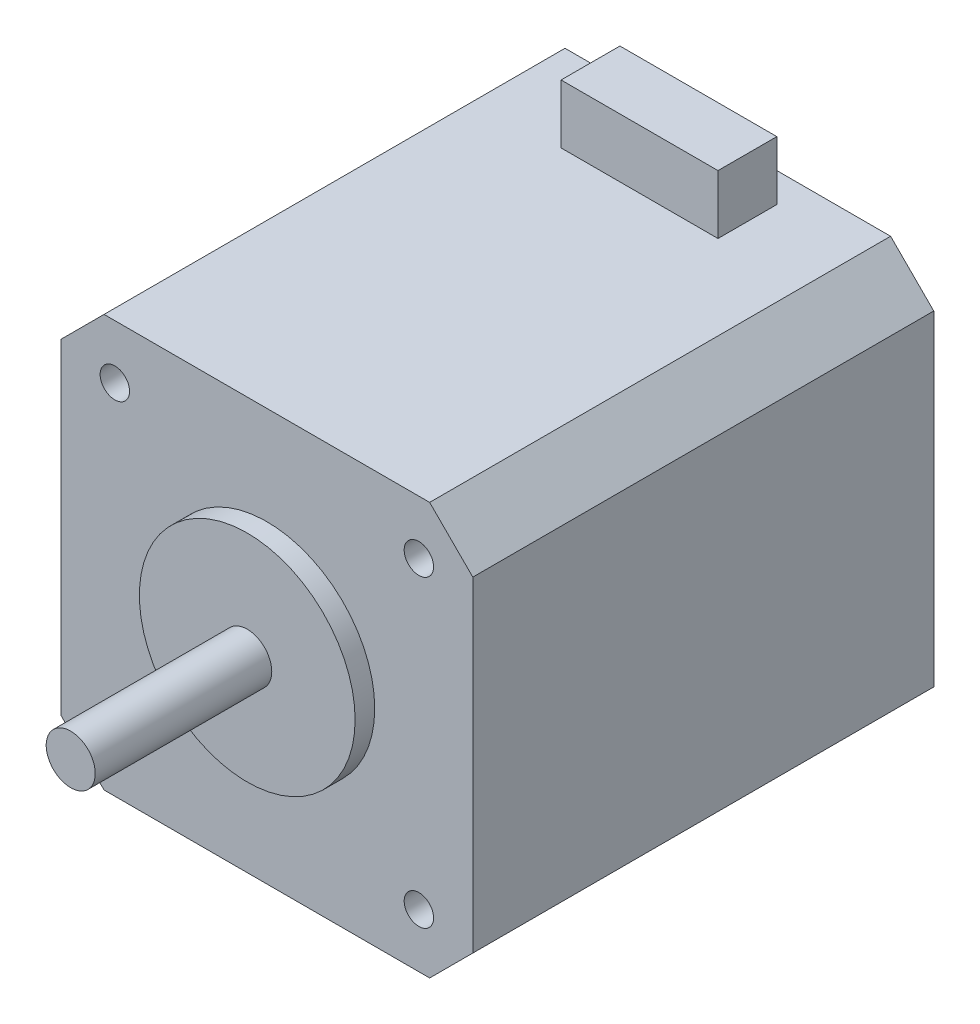
ISO-10303-21;
HEADER;
FILE_DESCRIPTION(('STEP AP214'),'2;1');
FILE_NAME('part.step','',(''),(''),'','','');
FILE_SCHEMA(('AUTOMOTIVE_DESIGN { 1 0 10303 214 1 1 1 1 }'));
ENDSEC;
DATA;
#1=APPLICATION_CONTEXT('core data for automotive mechanical design processes');
#2=APPLICATION_PROTOCOL_DEFINITION('international standard','automotive_design',2000,#1);
#3=PRODUCT_CONTEXT('',#1,'mechanical');
#4=PRODUCT('Part','Part','',(#3));
#5=PRODUCT_RELATED_PRODUCT_CATEGORY('part','',(#4));
#6=PRODUCT_DEFINITION_FORMATION('','',#4);
#7=PRODUCT_DEFINITION_CONTEXT('part definition',#1,'design');
#8=PRODUCT_DEFINITION('design','',#6,#7);
#9=PRODUCT_DEFINITION_SHAPE('','',#8);
#10=(LENGTH_UNIT() NAMED_UNIT(*) SI_UNIT(.MILLI.,.METRE.));
#11=(NAMED_UNIT(*) PLANE_ANGLE_UNIT() SI_UNIT($,.RADIAN.));
#12=(NAMED_UNIT(*) SI_UNIT($,.STERADIAN.) SOLID_ANGLE_UNIT());
#13=UNCERTAINTY_MEASURE_WITH_UNIT(LENGTH_MEASURE(1.E-05),#10,'distance_accuracy_value','');
#14=(GEOMETRIC_REPRESENTATION_CONTEXT(3) GLOBAL_UNCERTAINTY_ASSIGNED_CONTEXT((#13)) GLOBAL_UNIT_ASSIGNED_CONTEXT((#10,
#11,#12)) REPRESENTATION_CONTEXT('',''));
#15=CARTESIAN_POINT('',(0.,0.,0.));
#16=DIRECTION('',(0.,0.,1.));
#17=DIRECTION('',(1.,0.,0.));
#18=AXIS2_PLACEMENT_3D('',#15,#16,#17);
#19=CARTESIAN_POINT('',(0.,0.,47.));
#20=DIRECTION('',(0.,0.,1.));
#21=DIRECTION('',(1.,0.,0.));
#22=AXIS2_PLACEMENT_3D('',#19,#20,#21);
#23=PLANE('',#22);
#24=CARTESIAN_POINT('',(0.,0.,47.));
#25=DIRECTION('',(0.,0.,1.));
#26=DIRECTION('',(1.,0.,0.));
#27=AXIS2_PLACEMENT_3D('',#24,#25,#26);
#28=CIRCLE('',#27,11.);
#29=CARTESIAN_POINT('',(11.,0.,47.));
#30=VERTEX_POINT('',#29);
#31=EDGE_CURVE('E262',#30,#30,#28,.T.);
#32=ORIENTED_EDGE('',*,*,#31,.F.);
#33=EDGE_LOOP('',(#32));
#34=FACE_BOUND('',#33,.T.);
#35=CARTESIAN_POINT('',(-15.5000000000001,-15.4999999999999,47.));
#36=DIRECTION('',(0.,0.,1.));
#37=DIRECTION('',(1.,0.,0.));
#38=AXIS2_PLACEMENT_3D('',#35,#36,#37);
#39=CIRCLE('',#38,1.5);
#40=CARTESIAN_POINT('',(-14.0000000000001,-15.4999999999999,47.));
#41=VERTEX_POINT('',#40);
#42=EDGE_CURVE('E242',#41,#41,#39,.T.);
#43=ORIENTED_EDGE('',*,*,#42,.F.);
#44=EDGE_LOOP('',(#43));
#45=FACE_BOUND('',#44,.T.);
#46=CARTESIAN_POINT('',(15.5,15.5,47.));
#47=DIRECTION('',(0.,0.,1.));
#48=DIRECTION('',(1.,0.,0.));
#49=AXIS2_PLACEMENT_3D('',#46,#47,#48);
#50=CIRCLE('',#49,1.5);
#51=CARTESIAN_POINT('',(17.,15.5,47.));
#52=VERTEX_POINT('',#51);
#53=EDGE_CURVE('E161',#52,#52,#50,.T.);
#54=ORIENTED_EDGE('',*,*,#53,.F.);
#55=EDGE_LOOP('',(#54));
#56=FACE_BOUND('',#55,.T.);
#57=DIRECTION('',(0.,1.,0.));
#58=VECTOR('',#57,1.);
#59=CARTESIAN_POINT('',(20.9999999999999,-16.6000000000001,47.));
#60=LINE('',#59,#58);
#61=CARTESIAN_POINT('',(20.9999999999999,-16.6000000000001,47.));
#62=VERTEX_POINT('',#61);
#63=CARTESIAN_POINT('',(21.,16.6,47.));
#64=VERTEX_POINT('',#63);
#65=EDGE_CURVE('E108',#62,#64,#60,.T.);
#66=ORIENTED_EDGE('',*,*,#65,.T.);
#67=DIRECTION('',(-0.707106781186548,0.707106781186548,0.));
#68=VECTOR('',#67,1.);
#69=CARTESIAN_POINT('',(21.,16.6,47.));
#70=LINE('',#69,#68);
#71=CARTESIAN_POINT('',(16.6,21.,47.));
#72=VERTEX_POINT('',#71);
#73=EDGE_CURVE('E209',#64,#72,#70,.T.);
#74=ORIENTED_EDGE('',*,*,#73,.T.);
#75=DIRECTION('',(-1.,0.,0.));
#76=VECTOR('',#75,1.);
#77=CARTESIAN_POINT('',(16.6,21.,47.));
#78=LINE('',#77,#76);
#79=CARTESIAN_POINT('',(-16.5999999999998,21.0000000000002,47.));
#80=VERTEX_POINT('',#79);
#81=EDGE_CURVE('E205',#72,#80,#78,.T.);
#82=ORIENTED_EDGE('',*,*,#81,.T.);
#83=DIRECTION('',(-0.707106781186555,-0.70710678118654,0.));
#84=VECTOR('',#83,1.);
#85=CARTESIAN_POINT('',(-16.5999999999998,21.0000000000002,47.));
#86=LINE('',#85,#84);
#87=CARTESIAN_POINT('',(-20.9999999999998,16.6000000000002,47.));
#88=VERTEX_POINT('',#87);
#89=EDGE_CURVE('E220',#80,#88,#86,.T.);
#90=ORIENTED_EDGE('',*,*,#89,.T.);
#91=DIRECTION('',(0.,-1.,0.));
#92=VECTOR('',#91,1.);
#93=CARTESIAN_POINT('',(-20.9999999999998,16.6000000000002,47.));
#94=LINE('',#93,#92);
#95=CARTESIAN_POINT('',(-21.0000000000001,-16.5999999999999,47.));
#96=VERTEX_POINT('',#95);
#97=EDGE_CURVE('E132',#88,#96,#94,.T.);
#98=ORIENTED_EDGE('',*,*,#97,.T.);
#99=DIRECTION('',(0.707106781186542,-0.707106781186553,0.));
#100=VECTOR('',#99,1.);
#101=CARTESIAN_POINT('',(-21.0000000000001,-16.5999999999999,47.));
#102=LINE('',#101,#100);
#103=CARTESIAN_POINT('',(-16.6000000000002,-20.9999999999999,47.));
#104=VERTEX_POINT('',#103);
#105=EDGE_CURVE('E125',#96,#104,#102,.T.);
#106=ORIENTED_EDGE('',*,*,#105,.T.);
#107=DIRECTION('',(1.,0.,0.));
#108=VECTOR('',#107,1.);
#109=CARTESIAN_POINT('',(-16.6000000000002,-20.9999999999999,47.));
#110=LINE('',#109,#108);
#111=CARTESIAN_POINT('',(16.5999999999999,-21.0000000000001,47.));
#112=VERTEX_POINT('',#111);
#113=EDGE_CURVE('E129',#104,#112,#110,.T.);
#114=ORIENTED_EDGE('',*,*,#113,.T.);
#115=DIRECTION('',(0.70710678118655,0.707106781186545,0.));
#116=VECTOR('',#115,1.);
#117=CARTESIAN_POINT('',(16.5999999999999,-21.0000000000001,47.));
#118=LINE('',#117,#116);
#119=EDGE_CURVE('E69',#112,#62,#118,.T.);
#120=ORIENTED_EDGE('',*,*,#119,.T.);
#121=EDGE_LOOP('',(#66,#74,#82,#90,#98,#106,#114,#120));
#122=FACE_BOUND('',#121,.T.);
#123=CARTESIAN_POINT('',(15.4999999999999,-15.5000000000001,47.));
#124=DIRECTION('',(0.,0.,1.));
#125=DIRECTION('',(1.,0.,0.));
#126=AXIS2_PLACEMENT_3D('',#123,#124,#125);
#127=CIRCLE('',#126,1.5);
#128=CARTESIAN_POINT('',(16.9999999999999,-15.5000000000001,47.));
#129=VERTEX_POINT('',#128);
#130=EDGE_CURVE('E234',#129,#129,#127,.T.);
#131=ORIENTED_EDGE('',*,*,#130,.F.);
#132=EDGE_LOOP('',(#131));
#133=FACE_BOUND('',#132,.T.);
#134=CARTESIAN_POINT('',(-15.4999999999998,15.5000000000002,47.));
#135=DIRECTION('',(0.,0.,1.));
#136=DIRECTION('',(1.,0.,0.));
#137=AXIS2_PLACEMENT_3D('',#134,#135,#136);
#138=CIRCLE('',#137,1.5);
#139=CARTESIAN_POINT('',(-13.9999999999998,15.5000000000002,47.));
#140=VERTEX_POINT('',#139);
#141=EDGE_CURVE('E250',#140,#140,#138,.T.);
#142=ORIENTED_EDGE('',*,*,#141,.F.);
#143=EDGE_LOOP('',(#142));
#144=FACE_BOUND('',#143,.T.);
#145=ADVANCED_FACE('F43',(#34,#45,#56,#122,#133,#144),#23,.T.);
#146=CARTESIAN_POINT('',(0.,0.,0.));
#147=DIRECTION('',(0.,0.,1.));
#148=DIRECTION('',(1.,0.,0.));
#149=AXIS2_PLACEMENT_3D('',#146,#147,#148);
#150=PLANE('',#149);
#151=DIRECTION('',(0.,1.,0.));
#152=VECTOR('',#151,1.);
#153=CARTESIAN_POINT('',(21.,0.,0.));
#154=LINE('',#153,#152);
#155=CARTESIAN_POINT('',(20.9999999999999,-16.6000000000001,0.));
#156=VERTEX_POINT('',#155);
#157=CARTESIAN_POINT('',(21.,16.6,0.));
#158=VERTEX_POINT('',#157);
#159=EDGE_CURVE('E102',#156,#158,#154,.T.);
#160=ORIENTED_EDGE('',*,*,#159,.F.);
#161=DIRECTION('',(0.70710678118655,0.707106781186545,0.));
#162=VECTOR('',#161,1.);
#163=CARTESIAN_POINT('',(16.5999999999999,-21.0000000000001,0.));
#164=LINE('',#163,#162);
#165=CARTESIAN_POINT('',(16.5999999999999,-21.0000000000001,0.));
#166=VERTEX_POINT('',#165);
#167=EDGE_CURVE('E180',#166,#156,#164,.T.);
#168=ORIENTED_EDGE('',*,*,#167,.F.);
#169=DIRECTION('',(1.,0.,0.));
#170=VECTOR('',#169,1.);
#171=CARTESIAN_POINT('',(0.,-21.,0.));
#172=LINE('',#171,#170);
#173=CARTESIAN_POINT('',(-16.6000000000002,-20.9999999999999,0.));
#174=VERTEX_POINT('',#173);
#175=EDGE_CURVE('E177',#174,#166,#172,.T.);
#176=ORIENTED_EDGE('',*,*,#175,.F.);
#177=DIRECTION('',(0.707106781186542,-0.707106781186553,0.));
#178=VECTOR('',#177,1.);
#179=CARTESIAN_POINT('',(-21.0000000000001,-16.5999999999999,0.));
#180=LINE('',#179,#178);
#181=CARTESIAN_POINT('',(-21.0000000000001,-16.5999999999999,0.));
#182=VERTEX_POINT('',#181);
#183=EDGE_CURVE('E143',#182,#174,#180,.T.);
#184=ORIENTED_EDGE('',*,*,#183,.F.);
#185=DIRECTION('',(0.,-1.,0.));
#186=VECTOR('',#185,1.);
#187=CARTESIAN_POINT('',(-21.,1.46642216231412E-13,0.));
#188=LINE('',#187,#186);
#189=CARTESIAN_POINT('',(-20.9999999999998,16.6000000000002,0.));
#190=VERTEX_POINT('',#189);
#191=EDGE_CURVE('E172',#190,#182,#188,.T.);
#192=ORIENTED_EDGE('',*,*,#191,.F.);
#193=DIRECTION('',(-0.707106781186555,-0.70710678118654,0.));
#194=VECTOR('',#193,1.);
#195=CARTESIAN_POINT('',(-16.5999999999998,21.0000000000002,0.));
#196=LINE('',#195,#194);
#197=CARTESIAN_POINT('',(-16.5999999999998,21.0000000000002,0.));
#198=VERTEX_POINT('',#197);
#199=EDGE_CURVE('E168',#198,#190,#196,.T.);
#200=ORIENTED_EDGE('',*,*,#199,.F.);
#201=DIRECTION('',(-1.,0.,0.));
#202=VECTOR('',#201,1.);
#203=CARTESIAN_POINT('',(0.,21.,0.));
#204=LINE('',#203,#202);
#205=CARTESIAN_POINT('',(16.6,21.,0.));
#206=VERTEX_POINT('',#205);
#207=EDGE_CURVE('E165',#206,#198,#204,.T.);
#208=ORIENTED_EDGE('',*,*,#207,.F.);
#209=DIRECTION('',(-0.707106781186548,0.707106781186548,0.));
#210=VECTOR('',#209,1.);
#211=CARTESIAN_POINT('',(21.,16.6,0.));
#212=LINE('',#211,#210);
#213=EDGE_CURVE('E160',#158,#206,#212,.T.);
#214=ORIENTED_EDGE('',*,*,#213,.F.);
#215=EDGE_LOOP('',(#160,#168,#176,#184,#192,#200,#208,#214));
#216=FACE_BOUND('',#215,.T.);
#217=CARTESIAN_POINT('',(15.5,15.5,0.));
#218=DIRECTION('',(0.,0.,1.));
#219=DIRECTION('',(1.,0.,0.));
#220=AXIS2_PLACEMENT_3D('',#217,#218,#219);
#221=CIRCLE('',#220,1.5);
#222=CARTESIAN_POINT('',(17.,15.5,0.));
#223=VERTEX_POINT('',#222);
#224=EDGE_CURVE('E230',#223,#223,#221,.T.);
#225=ORIENTED_EDGE('',*,*,#224,.T.);
#226=EDGE_LOOP('',(#225));
#227=FACE_BOUND('',#226,.T.);
#228=CARTESIAN_POINT('',(15.4999999999999,-15.5000000000001,0.));
#229=DIRECTION('',(0.,0.,1.));
#230=DIRECTION('',(1.,0.,0.));
#231=AXIS2_PLACEMENT_3D('',#228,#229,#230);
#232=CIRCLE('',#231,1.5);
#233=CARTESIAN_POINT('',(16.9999999999999,-15.5000000000001,0.));
#234=VERTEX_POINT('',#233);
#235=EDGE_CURVE('E238',#234,#234,#232,.T.);
#236=ORIENTED_EDGE('',*,*,#235,.T.);
#237=EDGE_LOOP('',(#236));
#238=FACE_BOUND('',#237,.T.);
#239=CARTESIAN_POINT('',(-15.5000000000001,-15.4999999999999,0.));
#240=DIRECTION('',(0.,0.,1.));
#241=DIRECTION('',(1.,0.,0.));
#242=AXIS2_PLACEMENT_3D('',#239,#240,#241);
#243=CIRCLE('',#242,1.5);
#244=CARTESIAN_POINT('',(-14.0000000000001,-15.4999999999999,0.));
#245=VERTEX_POINT('',#244);
#246=EDGE_CURVE('E246',#245,#245,#243,.T.);
#247=ORIENTED_EDGE('',*,*,#246,.T.);
#248=EDGE_LOOP('',(#247));
#249=FACE_BOUND('',#248,.T.);
#250=CARTESIAN_POINT('',(-15.4999999999998,15.5000000000002,0.));
#251=DIRECTION('',(0.,0.,1.));
#252=DIRECTION('',(1.,0.,0.));
#253=AXIS2_PLACEMENT_3D('',#250,#251,#252);
#254=CIRCLE('',#253,1.5);
#255=CARTESIAN_POINT('',(-13.9999999999998,15.5000000000002,0.));
#256=VERTEX_POINT('',#255);
#257=EDGE_CURVE('E254',#256,#256,#254,.T.);
#258=ORIENTED_EDGE('',*,*,#257,.T.);
#259=EDGE_LOOP('',(#258));
#260=FACE_BOUND('',#259,.T.);
#261=ADVANCED_FACE('F210',(#216,#227,#238,#249,#260),#150,.F.);
#262=CARTESIAN_POINT('',(21.,0.,47.));
#263=DIRECTION('',(-1.,0.,0.));
#264=DIRECTION('',(0.,0.,1.));
#265=AXIS2_PLACEMENT_3D('',#262,#263,#264);
#266=PLANE('',#265);
#267=ORIENTED_EDGE('',*,*,#159,.T.);
#268=DIRECTION('',(0.,0.,-1.));
#269=VECTOR('',#268,1.);
#270=CARTESIAN_POINT('',(21.,16.6,47.));
#271=LINE('',#270,#269);
#272=EDGE_CURVE('E11',#64,#158,#271,.T.);
#273=ORIENTED_EDGE('',*,*,#272,.F.);
#274=ORIENTED_EDGE('',*,*,#65,.F.);
#275=DIRECTION('',(0.,0.,-1.));
#276=VECTOR('',#275,1.);
#277=CARTESIAN_POINT('',(20.9999999999999,-16.6000000000001,47.));
#278=LINE('',#277,#276);
#279=EDGE_CURVE('E154',#62,#156,#278,.T.);
#280=ORIENTED_EDGE('',*,*,#279,.T.);
#281=EDGE_LOOP('',(#267,#273,#274,#280));
#282=FACE_BOUND('',#281,.T.);
#283=ADVANCED_FACE('F45',(#282),#266,.F.);
#284=CARTESIAN_POINT('',(21.,16.6,47.));
#285=DIRECTION('',(-0.707106781186547,-0.707106781186547,0.));
#286=DIRECTION('',(0.707106781186548,-0.707106781186548,0.));
#287=AXIS2_PLACEMENT_3D('',#284,#285,#286);
#288=PLANE('',#287);
#289=ORIENTED_EDGE('',*,*,#213,.T.);
#290=DIRECTION('',(0.,0.,-1.));
#291=VECTOR('',#290,1.);
#292=CARTESIAN_POINT('',(16.6,21.,47.));
#293=LINE('',#292,#291);
#294=EDGE_CURVE('E53',#72,#206,#293,.T.);
#295=ORIENTED_EDGE('',*,*,#294,.F.);
#296=ORIENTED_EDGE('',*,*,#73,.F.);
#297=ORIENTED_EDGE('',*,*,#272,.T.);
#298=EDGE_LOOP('',(#289,#295,#296,#297));
#299=FACE_BOUND('',#298,.T.);
#300=ADVANCED_FACE('F208',(#299),#288,.F.);
#301=CARTESIAN_POINT('',(0.,21.,47.));
#302=DIRECTION('',(0.,-1.,0.));
#303=DIRECTION('',(1.,0.,0.));
#304=AXIS2_PLACEMENT_3D('',#301,#302,#303);
#305=PLANE('',#304);
#306=DIRECTION('',(0.,0.,-1.));
#307=VECTOR('',#306,1.);
#308=CARTESIAN_POINT('',(-7.99999999999978,21.0000000000001,9.));
#309=LINE('',#308,#307);
#310=CARTESIAN_POINT('',(-7.99999999999978,21.0000000000001,9.));
#311=VERTEX_POINT('',#310);
#312=CARTESIAN_POINT('',(-7.99999999999978,21.0000000000001,3.));
#313=VERTEX_POINT('',#312);
#314=EDGE_CURVE('E288',#311,#313,#309,.T.);
#315=ORIENTED_EDGE('',*,*,#314,.T.);
#316=DIRECTION('',(1.,0.,0.));
#317=VECTOR('',#316,1.);
#318=CARTESIAN_POINT('',(-7.99999999999978,21.0000000000001,3.));
#319=LINE('',#318,#317);
#320=CARTESIAN_POINT('',(8.00000000000022,20.9999999999999,3.));
#321=VERTEX_POINT('',#320);
#322=EDGE_CURVE('E299',#313,#321,#319,.T.);
#323=ORIENTED_EDGE('',*,*,#322,.T.);
#324=DIRECTION('',(0.,0.,1.));
#325=VECTOR('',#324,1.);
#326=CARTESIAN_POINT('',(8.00000000000022,20.9999999999999,3.));
#327=LINE('',#326,#325);
#328=CARTESIAN_POINT('',(8.00000000000022,20.9999999999999,8.99999999999999));
#329=VERTEX_POINT('',#328);
#330=EDGE_CURVE('E295',#321,#329,#327,.T.);
#331=ORIENTED_EDGE('',*,*,#330,.T.);
#332=DIRECTION('',(1.,0.,0.));
#333=VECTOR('',#332,1.);
#334=CARTESIAN_POINT('',(-7.99999999999978,21.0000000000001,9.));
#335=LINE('',#334,#333);
#336=EDGE_CURVE('E60',#311,#329,#335,.T.);
#337=ORIENTED_EDGE('',*,*,#336,.F.);
#338=EDGE_LOOP('',(#315,#323,#331,#337));
#339=FACE_BOUND('',#338,.T.);
#340=ORIENTED_EDGE('',*,*,#207,.T.);
#341=DIRECTION('',(0.,0.,-1.));
#342=VECTOR('',#341,1.);
#343=CARTESIAN_POINT('',(-16.5999999999998,21.0000000000002,47.));
#344=LINE('',#343,#342);
#345=EDGE_CURVE('E194',#80,#198,#344,.T.);
#346=ORIENTED_EDGE('',*,*,#345,.F.);
#347=ORIENTED_EDGE('',*,*,#81,.F.);
#348=ORIENTED_EDGE('',*,*,#294,.T.);
#349=EDGE_LOOP('',(#340,#346,#347,#348));
#350=FACE_BOUND('',#349,.T.);
#351=ADVANCED_FACE('F203',(#339,#350),#305,.F.);
#352=CARTESIAN_POINT('',(-16.5999999999998,21.0000000000002,47.));
#353=DIRECTION('',(0.70710678118654,-0.707106781186555,0.));
#354=DIRECTION('',(0.707106781186555,0.70710678118654,0.));
#355=AXIS2_PLACEMENT_3D('',#352,#353,#354);
#356=PLANE('',#355);
#357=ORIENTED_EDGE('',*,*,#199,.T.);
#358=DIRECTION('',(0.,0.,-1.));
#359=VECTOR('',#358,1.);
#360=CARTESIAN_POINT('',(-20.9999999999998,16.6000000000002,47.));
#361=LINE('',#360,#359);
#362=EDGE_CURVE('E190',#88,#190,#361,.T.);
#363=ORIENTED_EDGE('',*,*,#362,.F.);
#364=ORIENTED_EDGE('',*,*,#89,.F.);
#365=ORIENTED_EDGE('',*,*,#345,.T.);
#366=EDGE_LOOP('',(#357,#363,#364,#365));
#367=FACE_BOUND('',#366,.T.);
#368=ADVANCED_FACE('F215',(#367),#356,.F.);
#369=CARTESIAN_POINT('',(-21.,1.46642216231412E-13,47.));
#370=DIRECTION('',(1.,0.,0.));
#371=DIRECTION('',(0.,1.,0.));
#372=AXIS2_PLACEMENT_3D('',#369,#370,#371);
#373=PLANE('',#372);
#374=ORIENTED_EDGE('',*,*,#191,.T.);
#375=DIRECTION('',(0.,0.,-1.));
#376=VECTOR('',#375,1.);
#377=CARTESIAN_POINT('',(-21.0000000000001,-16.5999999999999,47.));
#378=LINE('',#377,#376);
#379=EDGE_CURVE('E146',#96,#182,#378,.T.);
#380=ORIENTED_EDGE('',*,*,#379,.F.);
#381=ORIENTED_EDGE('',*,*,#97,.F.);
#382=ORIENTED_EDGE('',*,*,#362,.T.);
#383=EDGE_LOOP('',(#374,#380,#381,#382));
#384=FACE_BOUND('',#383,.T.);
#385=ADVANCED_FACE('F218',(#384),#373,.F.);
#386=CARTESIAN_POINT('',(-21.0000000000001,-16.5999999999999,47.));
#387=DIRECTION('',(0.707106781186553,0.707106781186542,0.));
#388=DIRECTION('',(-0.707106781186542,0.707106781186553,0.));
#389=AXIS2_PLACEMENT_3D('',#386,#387,#388);
#390=PLANE('',#389);
#391=ORIENTED_EDGE('',*,*,#183,.T.);
#392=DIRECTION('',(0.,0.,-1.));
#393=VECTOR('',#392,1.);
#394=CARTESIAN_POINT('',(-16.6000000000002,-20.9999999999999,47.));
#395=LINE('',#394,#393);
#396=EDGE_CURVE('E140',#104,#174,#395,.T.);
#397=ORIENTED_EDGE('',*,*,#396,.F.);
#398=ORIENTED_EDGE('',*,*,#105,.F.);
#399=ORIENTED_EDGE('',*,*,#379,.T.);
#400=EDGE_LOOP('',(#391,#397,#398,#399));
#401=FACE_BOUND('',#400,.T.);
#402=ADVANCED_FACE('F141',(#401),#390,.F.);
#403=CARTESIAN_POINT('',(0.,-21.,47.));
#404=DIRECTION('',(0.,1.,0.));
#405=DIRECTION('',(-1.,0.,0.));
#406=AXIS2_PLACEMENT_3D('',#403,#404,#405);
#407=PLANE('',#406);
#408=ORIENTED_EDGE('',*,*,#175,.T.);
#409=DIRECTION('',(0.,0.,-1.));
#410=VECTOR('',#409,1.);
#411=CARTESIAN_POINT('',(16.5999999999999,-21.0000000000001,47.));
#412=LINE('',#411,#410);
#413=EDGE_CURVE('E147',#112,#166,#412,.T.);
#414=ORIENTED_EDGE('',*,*,#413,.F.);
#415=ORIENTED_EDGE('',*,*,#113,.F.);
#416=ORIENTED_EDGE('',*,*,#396,.T.);
#417=EDGE_LOOP('',(#408,#414,#415,#416));
#418=FACE_BOUND('',#417,.T.);
#419=ADVANCED_FACE('F149',(#418),#407,.F.);
#420=CARTESIAN_POINT('',(16.5999999999999,-21.0000000000001,47.));
#421=DIRECTION('',(-0.707106781186545,0.70710678118655,0.));
#422=DIRECTION('',(-0.70710678118655,-0.707106781186545,0.));
#423=AXIS2_PLACEMENT_3D('',#420,#421,#422);
#424=PLANE('',#423);
#425=ORIENTED_EDGE('',*,*,#167,.T.);
#426=ORIENTED_EDGE('',*,*,#279,.F.);
#427=ORIENTED_EDGE('',*,*,#119,.F.);
#428=ORIENTED_EDGE('',*,*,#413,.T.);
#429=EDGE_LOOP('',(#425,#426,#427,#428));
#430=FACE_BOUND('',#429,.T.);
#431=ADVANCED_FACE('F366',(#430),#424,.F.);
#432=CARTESIAN_POINT('',(15.5,15.5,47.));
#433=DIRECTION('',(0.,0.,-1.));
#434=DIRECTION('',(-1.,0.,0.));
#435=AXIS2_PLACEMENT_3D('',#432,#433,#434);
#436=CYLINDRICAL_SURFACE('',#435,1.5);
#437=ORIENTED_EDGE('',*,*,#53,.T.);
#438=EDGE_LOOP('',(#437));
#439=FACE_BOUND('',#438,.T.);
#440=ORIENTED_EDGE('',*,*,#224,.F.);
#441=EDGE_LOOP('',(#440));
#442=FACE_BOUND('',#441,.T.);
#443=ADVANCED_FACE('F363',(#439,#442),#436,.F.);
#444=CARTESIAN_POINT('',(15.4999999999999,-15.5000000000001,47.));
#445=DIRECTION('',(0.,0.,-1.));
#446=DIRECTION('',(-1.,0.,0.));
#447=AXIS2_PLACEMENT_3D('',#444,#445,#446);
#448=CYLINDRICAL_SURFACE('',#447,1.5);
#449=ORIENTED_EDGE('',*,*,#130,.T.);
#450=EDGE_LOOP('',(#449));
#451=FACE_BOUND('',#450,.T.);
#452=ORIENTED_EDGE('',*,*,#235,.F.);
#453=EDGE_LOOP('',(#452));
#454=FACE_BOUND('',#453,.T.);
#455=ADVANCED_FACE('F397',(#451,#454),#448,.F.);
#456=CARTESIAN_POINT('',(-15.5000000000001,-15.4999999999999,47.));
#457=DIRECTION('',(0.,0.,-1.));
#458=DIRECTION('',(-1.,0.,0.));
#459=AXIS2_PLACEMENT_3D('',#456,#457,#458);
#460=CYLINDRICAL_SURFACE('',#459,1.5);
#461=ORIENTED_EDGE('',*,*,#42,.T.);
#462=EDGE_LOOP('',(#461));
#463=FACE_BOUND('',#462,.T.);
#464=ORIENTED_EDGE('',*,*,#246,.F.);
#465=EDGE_LOOP('',(#464));
#466=FACE_BOUND('',#465,.T.);
#467=ADVANCED_FACE('F404',(#463,#466),#460,.F.);
#468=CARTESIAN_POINT('',(-15.4999999999998,15.5000000000002,47.));
#469=DIRECTION('',(0.,0.,-1.));
#470=DIRECTION('',(-1.,0.,0.));
#471=AXIS2_PLACEMENT_3D('',#468,#469,#470);
#472=CYLINDRICAL_SURFACE('',#471,1.5);
#473=ORIENTED_EDGE('',*,*,#141,.T.);
#474=EDGE_LOOP('',(#473));
#475=FACE_BOUND('',#474,.T.);
#476=ORIENTED_EDGE('',*,*,#257,.F.);
#477=EDGE_LOOP('',(#476));
#478=FACE_BOUND('',#477,.T.);
#479=ADVANCED_FACE('F411',(#475,#478),#472,.F.);
#480=CARTESIAN_POINT('',(0.,0.,49.));
#481=DIRECTION('',(0.,0.,-1.));
#482=DIRECTION('',(-1.,0.,0.));
#483=AXIS2_PLACEMENT_3D('',#480,#481,#482);
#484=CYLINDRICAL_SURFACE('',#483,11.);
#485=CARTESIAN_POINT('',(0.,0.,49.));
#486=DIRECTION('',(0.,0.,1.));
#487=DIRECTION('',(1.,0.,0.));
#488=AXIS2_PLACEMENT_3D('',#485,#486,#487);
#489=CIRCLE('',#488,11.);
#490=CARTESIAN_POINT('',(11.,0.,49.));
#491=VERTEX_POINT('',#490);
#492=EDGE_CURVE('E258',#491,#491,#489,.T.);
#493=ORIENTED_EDGE('',*,*,#492,.F.);
#494=EDGE_LOOP('',(#493));
#495=FACE_BOUND('',#494,.T.);
#496=ORIENTED_EDGE('',*,*,#31,.T.);
#497=EDGE_LOOP('',(#496));
#498=FACE_BOUND('',#497,.T.);
#499=ADVANCED_FACE('F419',(#495,#498),#484,.T.);
#500=CARTESIAN_POINT('',(0.,0.,49.));
#501=DIRECTION('',(0.,0.,1.));
#502=DIRECTION('',(1.,0.,0.));
#503=AXIS2_PLACEMENT_3D('',#500,#501,#502);
#504=PLANE('',#503);
#505=CARTESIAN_POINT('',(0.,0.,49.));
#506=DIRECTION('',(0.,0.,1.));
#507=DIRECTION('',(1.,0.,0.));
#508=AXIS2_PLACEMENT_3D('',#505,#506,#507);
#509=CIRCLE('',#508,2.5);
#510=CARTESIAN_POINT('',(2.5,0.,49.));
#511=VERTEX_POINT('',#510);
#512=EDGE_CURVE('E47',#511,#511,#509,.F.);
#513=ORIENTED_EDGE('',*,*,#512,.T.);
#514=EDGE_LOOP('',(#513));
#515=FACE_BOUND('',#514,.T.);
#516=ORIENTED_EDGE('',*,*,#492,.T.);
#517=EDGE_LOOP('',(#516));
#518=FACE_BOUND('',#517,.T.);
#519=ADVANCED_FACE('F427',(#515,#518),#504,.T.);
#520=CARTESIAN_POINT('',(0.,0.,67.));
#521=DIRECTION('',(0.,0.,-1.));
#522=DIRECTION('',(-1.,0.,0.));
#523=AXIS2_PLACEMENT_3D('',#520,#521,#522);
#524=CYLINDRICAL_SURFACE('',#523,2.5);
#525=ORIENTED_EDGE('',*,*,#512,.F.);
#526=EDGE_LOOP('',(#525));
#527=FACE_BOUND('',#526,.T.);
#528=CARTESIAN_POINT('',(0.,0.,67.));
#529=DIRECTION('',(0.,0.,1.));
#530=DIRECTION('',(1.,0.,0.));
#531=AXIS2_PLACEMENT_3D('',#528,#529,#530);
#532=CIRCLE('',#531,2.5);
#533=CARTESIAN_POINT('',(2.5,0.,67.));
#534=VERTEX_POINT('',#533);
#535=EDGE_CURVE('E269',#534,#534,#532,.T.);
#536=ORIENTED_EDGE('',*,*,#535,.F.);
#537=EDGE_LOOP('',(#536));
#538=FACE_BOUND('',#537,.T.);
#539=ADVANCED_FACE('F435',(#527,#538),#524,.T.);
#540=CARTESIAN_POINT('',(0.,0.,67.));
#541=DIRECTION('',(0.,0.,1.));
#542=DIRECTION('',(1.,0.,0.));
#543=AXIS2_PLACEMENT_3D('',#540,#541,#542);
#544=PLANE('',#543);
#545=ORIENTED_EDGE('',*,*,#535,.T.);
#546=EDGE_LOOP('',(#545));
#547=FACE_BOUND('',#546,.T.);
#548=ADVANCED_FACE('F443',(#547),#544,.T.);
#549=CARTESIAN_POINT('',(-7.99999999999972,27.0000000000001,3.));
#550=DIRECTION('',(0.,0.,-1.));
#551=DIRECTION('',(-1.,0.,0.));
#552=AXIS2_PLACEMENT_3D('',#549,#550,#551);
#553=PLANE('',#552);
#554=ORIENTED_EDGE('',*,*,#322,.F.);
#555=DIRECTION('',(0.,-1.,0.));
#556=VECTOR('',#555,1.);
#557=CARTESIAN_POINT('',(-7.99999999999972,27.0000000000001,3.));
#558=LINE('',#557,#556);
#559=CARTESIAN_POINT('',(-7.99999999999972,27.0000000000001,3.));
#560=VERTEX_POINT('',#559);
#561=EDGE_CURVE('E273',#560,#313,#558,.T.);
#562=ORIENTED_EDGE('',*,*,#561,.F.);
#563=DIRECTION('',(1.,0.,0.));
#564=VECTOR('',#563,1.);
#565=CARTESIAN_POINT('',(-7.99999999999972,27.0000000000001,3.));
#566=LINE('',#565,#564);
#567=CARTESIAN_POINT('',(8.00000000000028,26.9999999999999,3.));
#568=VERTEX_POINT('',#567);
#569=EDGE_CURVE('E292',#560,#568,#566,.T.);
#570=ORIENTED_EDGE('',*,*,#569,.T.);
#571=DIRECTION('',(0.,-1.,0.));
#572=VECTOR('',#571,1.);
#573=CARTESIAN_POINT('',(8.00000000000028,26.9999999999999,3.));
#574=LINE('',#573,#572);
#575=EDGE_CURVE('E274',#568,#321,#574,.T.);
#576=ORIENTED_EDGE('',*,*,#575,.T.);
#577=EDGE_LOOP('',(#554,#562,#570,#576));
#578=FACE_BOUND('',#577,.T.);
#579=ADVANCED_FACE('F321',(#578),#553,.T.);
#580=CARTESIAN_POINT('',(-7.99999999999972,27.0000000000001,9.));
#581=DIRECTION('',(-1.,0.,0.));
#582=DIRECTION('',(0.,-1.,0.));
#583=AXIS2_PLACEMENT_3D('',#580,#581,#582);
#584=PLANE('',#583);
#585=ORIENTED_EDGE('',*,*,#314,.F.);
#586=DIRECTION('',(0.,-1.,0.));
#587=VECTOR('',#586,1.);
#588=CARTESIAN_POINT('',(-7.99999999999972,27.0000000000001,9.));
#589=LINE('',#588,#587);
#590=CARTESIAN_POINT('',(-7.99999999999972,27.0000000000001,9.));
#591=VERTEX_POINT('',#590);
#592=EDGE_CURVE('E282',#591,#311,#589,.T.);
#593=ORIENTED_EDGE('',*,*,#592,.F.);
#594=DIRECTION('',(0.,0.,-1.));
#595=VECTOR('',#594,1.);
#596=CARTESIAN_POINT('',(-7.99999999999972,27.0000000000001,9.));
#597=LINE('',#596,#595);
#598=EDGE_CURVE('E279',#591,#560,#597,.T.);
#599=ORIENTED_EDGE('',*,*,#598,.T.);
#600=ORIENTED_EDGE('',*,*,#561,.T.);
#601=EDGE_LOOP('',(#585,#593,#599,#600));
#602=FACE_BOUND('',#601,.T.);
#603=ADVANCED_FACE('F336',(#602),#584,.T.);
#604=CARTESIAN_POINT('',(-7.99999999999972,27.0000000000001,9.));
#605=DIRECTION('',(0.,0.,-1.));
#606=DIRECTION('',(-1.,0.,0.));
#607=AXIS2_PLACEMENT_3D('',#604,#605,#606);
#608=PLANE('',#607);
#609=ORIENTED_EDGE('',*,*,#336,.T.);
#610=DIRECTION('',(0.,-1.,0.));
#611=VECTOR('',#610,1.);
#612=CARTESIAN_POINT('',(8.00000000000028,26.9999999999999,9.));
#613=LINE('',#612,#611);
#614=CARTESIAN_POINT('',(8.00000000000028,26.9999999999999,9.));
#615=VERTEX_POINT('',#614);
#616=EDGE_CURVE('E278',#615,#329,#613,.T.);
#617=ORIENTED_EDGE('',*,*,#616,.F.);
#618=DIRECTION('',(1.,0.,0.));
#619=VECTOR('',#618,1.);
#620=CARTESIAN_POINT('',(-7.99999999999972,27.0000000000001,9.));
#621=LINE('',#620,#619);
#622=EDGE_CURVE('E306',#591,#615,#621,.T.);
#623=ORIENTED_EDGE('',*,*,#622,.F.);
#624=ORIENTED_EDGE('',*,*,#592,.T.);
#625=EDGE_LOOP('',(#609,#617,#623,#624));
#626=FACE_BOUND('',#625,.T.);
#627=ADVANCED_FACE('F340',(#626),#608,.F.);
#628=CARTESIAN_POINT('',(8.00000000000028,26.9999999999999,3.));
#629=DIRECTION('',(1.,0.,0.));
#630=DIRECTION('',(0.,1.,0.));
#631=AXIS2_PLACEMENT_3D('',#628,#629,#630);
#632=PLANE('',#631);
#633=ORIENTED_EDGE('',*,*,#330,.F.);
#634=ORIENTED_EDGE('',*,*,#575,.F.);
#635=DIRECTION('',(0.,0.,1.));
#636=VECTOR('',#635,1.);
#637=CARTESIAN_POINT('',(8.00000000000028,26.9999999999999,3.));
#638=LINE('',#637,#636);
#639=EDGE_CURVE('E310',#568,#615,#638,.T.);
#640=ORIENTED_EDGE('',*,*,#639,.T.);
#641=ORIENTED_EDGE('',*,*,#616,.T.);
#642=EDGE_LOOP('',(#633,#634,#640,#641));
#643=FACE_BOUND('',#642,.T.);
#644=ADVANCED_FACE('F344',(#643),#632,.T.);
#645=CARTESIAN_POINT('',(2.81276006502361E-13,27.,0.));
#646=DIRECTION('',(0.,-1.,0.));
#647=DIRECTION('',(1.,0.,0.));
#648=AXIS2_PLACEMENT_3D('',#645,#646,#647);
#649=PLANE('',#648);
#650=ORIENTED_EDGE('',*,*,#569,.F.);
#651=ORIENTED_EDGE('',*,*,#598,.F.);
#652=ORIENTED_EDGE('',*,*,#622,.T.);
#653=ORIENTED_EDGE('',*,*,#639,.F.);
#654=EDGE_LOOP('',(#650,#651,#652,#653));
#655=FACE_BOUND('',#654,.T.);
#656=ADVANCED_FACE('F330',(#655),#649,.F.);
#657=CLOSED_SHELL('',(#145,#261,#283,#300,#351,#368,#385,#402,#419,#431,#443,#455,#467,#479,
#499,#519,#539,#548,#579,#603,#627,#644,#656));
#658=MANIFOLD_SOLID_BREP('B2',#657);
#659=ADVANCED_BREP_SHAPE_REPRESENTATION('',(#18,#658),#14);
#660=SHAPE_DEFINITION_REPRESENTATION(#9,#659);
ENDSEC;
END-ISO-10303-21;
